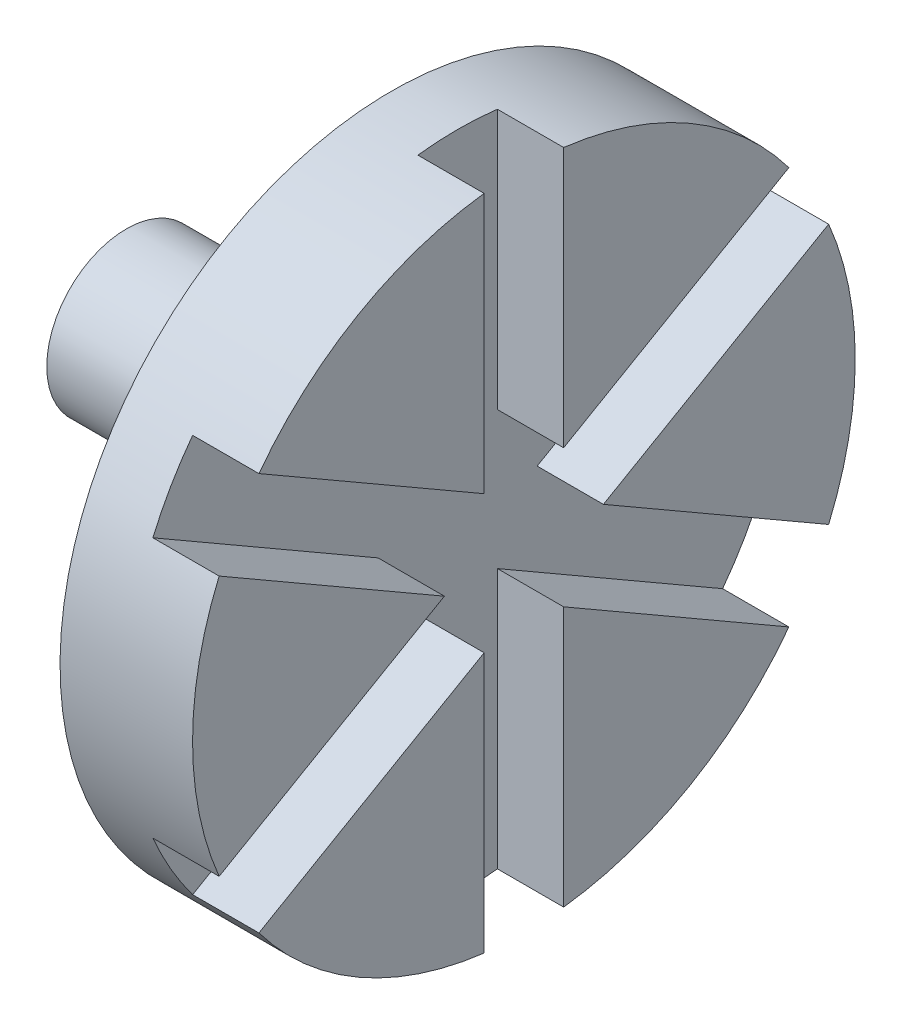
ISO-10303-21;
HEADER;
FILE_DESCRIPTION(('STEP AP214'),'2;1');
FILE_NAME('part.step','',(''),(''),'','','');
FILE_SCHEMA(('AUTOMOTIVE_DESIGN { 1 0 10303 214 1 1 1 1 }'));
ENDSEC;
DATA;
#1=APPLICATION_CONTEXT('core data for automotive mechanical design processes');
#2=APPLICATION_PROTOCOL_DEFINITION('international standard','automotive_design',2000,#1);
#3=PRODUCT_CONTEXT('',#1,'mechanical');
#4=PRODUCT('Part','Part','',(#3));
#5=PRODUCT_RELATED_PRODUCT_CATEGORY('part','',(#4));
#6=PRODUCT_DEFINITION_FORMATION('','',#4);
#7=PRODUCT_DEFINITION_CONTEXT('part definition',#1,'design');
#8=PRODUCT_DEFINITION('design','',#6,#7);
#9=PRODUCT_DEFINITION_SHAPE('','',#8);
#10=(LENGTH_UNIT() NAMED_UNIT(*) SI_UNIT(.MILLI.,.METRE.));
#11=(NAMED_UNIT(*) PLANE_ANGLE_UNIT() SI_UNIT($,.RADIAN.));
#12=(NAMED_UNIT(*) SI_UNIT($,.STERADIAN.) SOLID_ANGLE_UNIT());
#13=UNCERTAINTY_MEASURE_WITH_UNIT(LENGTH_MEASURE(1.E-05),#10,'distance_accuracy_value','');
#14=(GEOMETRIC_REPRESENTATION_CONTEXT(3) GLOBAL_UNCERTAINTY_ASSIGNED_CONTEXT((#13)) GLOBAL_UNIT_ASSIGNED_CONTEXT((#10,
#11,#12)) REPRESENTATION_CONTEXT('',''));
#15=CARTESIAN_POINT('',(0.,0.,0.));
#16=DIRECTION('',(0.,0.,1.));
#17=DIRECTION('',(1.,0.,0.));
#18=AXIS2_PLACEMENT_3D('',#15,#16,#17);
#19=CARTESIAN_POINT('',(10.,0.,0.));
#20=DIRECTION('',(1.,0.,0.));
#21=DIRECTION('',(0.,0.,-1.));
#22=AXIS2_PLACEMENT_3D('',#19,#20,#21);
#23=PLANE('',#22);
#24=DIRECTION('',(0.,1.,-1.48956837889716E-13));
#25=VECTOR('',#24,1.);
#26=CARTESIAN_POINT('',(10.,10.3923048454141,5.99999999999874));
#27=LINE('',#26,#25);
#28=CARTESIAN_POINT('',(10.,10.3923048454141,5.99999999999874));
#29=VERTEX_POINT('',#28);
#30=CARTESIAN_POINT('',(10.,49.6386945839643,5.99999999999289));
#31=VERTEX_POINT('',#30);
#32=EDGE_CURVE('E53',#29,#31,#27,.T.);
#33=ORIENTED_EDGE('',*,*,#32,.F.);
#34=DIRECTION('',(0.,-0.50000000000013,-0.866025403784363));
#35=VECTOR('',#34,1.);
#36=CARTESIAN_POINT('',(10.,10.3923048454141,5.99999999999874));
#37=LINE('',#36,#35);
#38=CARTESIAN_POINT('',(10.,30.0154997146943,39.9883705204051));
#39=VERTEX_POINT('',#38);
#40=EDGE_CURVE('E181',#39,#29,#37,.T.);
#41=ORIENTED_EDGE('',*,*,#40,.F.);
#42=CARTESIAN_POINT('',(10.,0.,0.));
#43=DIRECTION('',(1.,0.,0.));
#44=DIRECTION('',(0.,0.,-1.));
#45=AXIS2_PLACEMENT_3D('',#42,#43,#44);
#46=CIRCLE('',#45,50.);
#47=CARTESIAN_POINT('',(10.,19.6231948692802,45.9883705204072));
#48=VERTEX_POINT('',#47);
#49=EDGE_CURVE('E296',#39,#48,#46,.T.);
#50=ORIENTED_EDGE('',*,*,#49,.T.);
#51=DIRECTION('',(0.,0.500000000000103,0.866025403784379));
#52=VECTOR('',#51,1.);
#53=CARTESIAN_POINT('',(10.,1.17160607255054E-12,12.0000000000004));
#54=LINE('',#53,#52);
#55=CARTESIAN_POINT('',(10.,1.17354043149831E-12,12.0000000000004));
#56=VERTEX_POINT('',#55);
#57=EDGE_CURVE('E185',#56,#48,#54,.T.);
#58=ORIENTED_EDGE('',*,*,#57,.F.);
#59=DIRECTION('',(0.,0.499999999999896,-0.866025403784499));
#60=VECTOR('',#59,1.);
#61=CARTESIAN_POINT('',(10.,1.17160607255054E-12,12.0000000000004));
#62=LINE('',#61,#60);
#63=CARTESIAN_POINT('',(10.,-19.6231948692698,45.9883705204121));
#64=VERTEX_POINT('',#63);
#65=EDGE_CURVE('E182',#64,#56,#62,.T.);
#66=ORIENTED_EDGE('',*,*,#65,.F.);
#67=CARTESIAN_POINT('',(10.,-30.015499714685,39.9883705204119));
#68=VERTEX_POINT('',#67);
#69=EDGE_CURVE('E300',#64,#68,#46,.T.);
#70=ORIENTED_EDGE('',*,*,#69,.T.);
#71=DIRECTION('',(0.,-0.499999999999923,0.866025403784483));
#72=VECTOR('',#71,1.);
#73=CARTESIAN_POINT('',(10.,-10.3923048454132,6.00000000000117));
#74=LINE('',#73,#72);
#75=CARTESIAN_POINT('',(10.,-10.3923048454132,6.00000000000117));
#76=VERTEX_POINT('',#75);
#77=EDGE_CURVE('E214',#76,#68,#74,.T.);
#78=ORIENTED_EDGE('',*,*,#77,.F.);
#79=DIRECTION('',(0.,1.,0.));
#80=VECTOR('',#79,1.);
#81=CARTESIAN_POINT('',(10.,-10.3923048454132,6.00000000000117));
#82=LINE('',#81,#80);
#83=CARTESIAN_POINT('',(10.,-49.6386945839633,6.00000000000469));
#84=VERTEX_POINT('',#83);
#85=EDGE_CURVE('E209',#84,#76,#82,.T.);
#86=ORIENTED_EDGE('',*,*,#85,.F.);
#87=CARTESIAN_POINT('',(10.,-49.6386945839638,-5.99999999999705));
#88=VERTEX_POINT('',#87);
#89=EDGE_CURVE('E299',#84,#88,#46,.T.);
#90=ORIENTED_EDGE('',*,*,#89,.T.);
#91=DIRECTION('',(0.,-1.,0.));
#92=VECTOR('',#91,1.);
#93=CARTESIAN_POINT('',(10.,-10.3923048454133,-5.99999999999999));
#94=LINE('',#93,#92);
#95=CARTESIAN_POINT('',(10.,-10.3923048454133,-5.99999999999999));
#96=VERTEX_POINT('',#95);
#97=EDGE_CURVE('E258',#96,#88,#94,.T.);
#98=ORIENTED_EDGE('',*,*,#97,.F.);
#99=DIRECTION('',(0.,0.500000000000074,0.866025403784396));
#100=VECTOR('',#99,1.);
#101=CARTESIAN_POINT('',(10.,-10.3923048454133,-5.99999999999999));
#102=LINE('',#101,#100);
#103=CARTESIAN_POINT('',(10.,-30.0154997146912,-39.9883705204076));
#104=VERTEX_POINT('',#103);
#105=EDGE_CURVE('E253',#104,#96,#102,.T.);
#106=ORIENTED_EDGE('',*,*,#105,.F.);
#107=CARTESIAN_POINT('',(10.,-19.6231948692766,-45.9883705204089));
#108=VERTEX_POINT('',#107);
#109=EDGE_CURVE('E297',#104,#108,#46,.T.);
#110=ORIENTED_EDGE('',*,*,#109,.T.);
#111=DIRECTION('',(0.,-0.500000000000034,-0.866025403784419));
#112=VECTOR('',#111,1.);
#113=CARTESIAN_POINT('',(10.,0.,-12.));
#114=LINE('',#113,#112);
#115=CARTESIAN_POINT('',(10.,0.,-12.));
#116=VERTEX_POINT('',#115);
#117=EDGE_CURVE('E280',#116,#108,#114,.T.);
#118=ORIENTED_EDGE('',*,*,#117,.F.);
#119=DIRECTION('',(0.,-0.499999999999962,0.866025403784461));
#120=VECTOR('',#119,1.);
#121=CARTESIAN_POINT('',(10.,0.,-12.));
#122=LINE('',#121,#120);
#123=CARTESIAN_POINT('',(10.,19.6231948692735,-45.98837052041));
#124=VERTEX_POINT('',#123);
#125=EDGE_CURVE('E275',#124,#116,#122,.T.);
#126=ORIENTED_EDGE('',*,*,#125,.F.);
#127=CARTESIAN_POINT('',(10.,30.0154997146884,-39.9883705204093));
#128=VERTEX_POINT('',#127);
#129=EDGE_CURVE('E45',#124,#128,#46,.T.);
#130=ORIENTED_EDGE('',*,*,#129,.T.);
#131=DIRECTION('',(0.,0.500000000000001,-0.866025403784438));
#132=VECTOR('',#131,1.);
#133=CARTESIAN_POINT('',(10.,10.3923048454133,-5.99999999999996));
#134=LINE('',#133,#132);
#135=CARTESIAN_POINT('',(10.,10.3923048454133,-5.99999999999997));
#136=VERTEX_POINT('',#135);
#137=EDGE_CURVE('E236',#136,#128,#134,.T.);
#138=ORIENTED_EDGE('',*,*,#137,.F.);
#139=DIRECTION('',(0.,-1.,0.));
#140=VECTOR('',#139,1.);
#141=CARTESIAN_POINT('',(10.,10.3923048454133,-5.99999999999996));
#142=LINE('',#141,#140);
#143=CARTESIAN_POINT('',(10.,49.6386945839634,-5.99999999999997));
#144=VERTEX_POINT('',#143);
#145=EDGE_CURVE('E231',#144,#136,#142,.T.);
#146=ORIENTED_EDGE('',*,*,#145,.F.);
#147=EDGE_CURVE('E58',#144,#31,#46,.T.);
#148=ORIENTED_EDGE('',*,*,#147,.T.);
#149=EDGE_LOOP('',(#33,#41,#50,#58,#66,#70,#78,#86,#90,#98,#106,#110,#118,#126,#130,#138,#146,#148));
#150=FACE_BOUND('',#149,.T.);
#151=ADVANCED_FACE('F36',(#150),#23,.T.);
#152=CARTESIAN_POINT('',(10.,0.,0.));
#153=DIRECTION('',(-1.,0.,0.));
#154=DIRECTION('',(0.,0.,1.));
#155=AXIS2_PLACEMENT_3D('',#152,#153,#154);
#156=CYLINDRICAL_SURFACE('',#155,50.);
#157=ORIENTED_EDGE('',*,*,#129,.F.);
#158=DIRECTION('',(-1.,0.,0.));
#159=VECTOR('',#158,1.);
#160=CARTESIAN_POINT('',(20.,19.6231948692735,-45.9883705204101));
#161=LINE('',#160,#159);
#162=CARTESIAN_POINT('',(20.,19.6231948692735,-45.9883705204101));
#163=VERTEX_POINT('',#162);
#164=EDGE_CURVE('E284',#163,#124,#161,.T.);
#165=ORIENTED_EDGE('',*,*,#164,.F.);
#166=CARTESIAN_POINT('',(20.,-2.15105711021124E-13,1.31838984174237E-13));
#167=DIRECTION('',(1.,0.,0.));
#168=DIRECTION('',(0.,0.,1.));
#169=AXIS2_PLACEMENT_3D('',#166,#167,#168);
#170=CIRCLE('',#169,50.0000000000002);
#171=CARTESIAN_POINT('',(20.,-19.6231948692766,-45.9883705204089));
#172=VERTEX_POINT('',#171);
#173=EDGE_CURVE('E282',#172,#163,#170,.T.);
#174=ORIENTED_EDGE('',*,*,#173,.F.);
#175=DIRECTION('',(-1.,0.,0.));
#176=VECTOR('',#175,1.);
#177=CARTESIAN_POINT('',(20.,-19.6231948692766,-45.9883705204089));
#178=LINE('',#177,#176);
#179=EDGE_CURVE('E291',#172,#108,#178,.T.);
#180=ORIENTED_EDGE('',*,*,#179,.T.);
#181=ORIENTED_EDGE('',*,*,#109,.F.);
#182=DIRECTION('',(-1.,0.,0.));
#183=VECTOR('',#182,1.);
#184=CARTESIAN_POINT('',(20.,-30.0154997146912,-39.9883705204076));
#185=LINE('',#184,#183);
#186=CARTESIAN_POINT('',(20.,-30.0154997146912,-39.9883705204076));
#187=VERTEX_POINT('',#186);
#188=EDGE_CURVE('E262',#187,#104,#185,.T.);
#189=ORIENTED_EDGE('',*,*,#188,.F.);
#190=CARTESIAN_POINT('',(20.,-2.15105711021124E-13,1.31838984174237E-13));
#191=DIRECTION('',(1.,0.,0.));
#192=DIRECTION('',(0.,0.,1.));
#193=AXIS2_PLACEMENT_3D('',#190,#191,#192);
#194=CIRCLE('',#193,50.0000000000003);
#195=CARTESIAN_POINT('',(20.,-49.6386945839642,-5.99999999999711));
#196=VERTEX_POINT('',#195);
#197=EDGE_CURVE('E260',#196,#187,#194,.T.);
#198=ORIENTED_EDGE('',*,*,#197,.F.);
#199=DIRECTION('',(-1.,0.,0.));
#200=VECTOR('',#199,1.);
#201=CARTESIAN_POINT('',(20.,-49.6386945839642,-5.99999999999711));
#202=LINE('',#201,#200);
#203=EDGE_CURVE('E269',#196,#88,#202,.T.);
#204=ORIENTED_EDGE('',*,*,#203,.T.);
#205=ORIENTED_EDGE('',*,*,#89,.F.);
#206=DIRECTION('',(-1.,0.,0.));
#207=VECTOR('',#206,1.);
#208=CARTESIAN_POINT('',(20.,-49.6386945839633,6.00000000000469));
#209=LINE('',#208,#207);
#210=CARTESIAN_POINT('',(20.,-49.6386945839633,6.00000000000469));
#211=VERTEX_POINT('',#210);
#212=EDGE_CURVE('E218',#211,#84,#209,.T.);
#213=ORIENTED_EDGE('',*,*,#212,.F.);
#214=CARTESIAN_POINT('',(20.,-2.15105711021124E-13,1.31838984174237E-13));
#215=DIRECTION('',(1.,0.,0.));
#216=DIRECTION('',(0.,0.,1.));
#217=AXIS2_PLACEMENT_3D('',#214,#215,#216);
#218=CIRCLE('',#217,50.0000000000003);
#219=CARTESIAN_POINT('',(20.,-30.0154997146853,39.9883705204123));
#220=VERTEX_POINT('',#219);
#221=EDGE_CURVE('E216',#220,#211,#218,.T.);
#222=ORIENTED_EDGE('',*,*,#221,.F.);
#223=DIRECTION('',(-1.,0.,0.));
#224=VECTOR('',#223,1.);
#225=CARTESIAN_POINT('',(20.,-30.0154997146853,39.9883705204123));
#226=LINE('',#225,#224);
#227=EDGE_CURVE('E225',#220,#68,#226,.T.);
#228=ORIENTED_EDGE('',*,*,#227,.T.);
#229=ORIENTED_EDGE('',*,*,#69,.F.);
#230=DIRECTION('',(-1.,0.,0.));
#231=VECTOR('',#230,1.);
#232=CARTESIAN_POINT('',(20.,-19.6231948692698,45.9883705204121));
#233=LINE('',#232,#231);
#234=CARTESIAN_POINT('',(20.,-19.6231948692698,45.9883705204121));
#235=VERTEX_POINT('',#234);
#236=EDGE_CURVE('E197',#235,#64,#233,.T.);
#237=ORIENTED_EDGE('',*,*,#236,.F.);
#238=CARTESIAN_POINT('',(20.,-2.15105711021124E-13,1.31838984174237E-13));
#239=DIRECTION('',(1.,0.,0.));
#240=DIRECTION('',(0.,0.,1.));
#241=AXIS2_PLACEMENT_3D('',#238,#239,#240);
#242=CIRCLE('',#241,50.0000000000002);
#243=CARTESIAN_POINT('',(20.,19.6231948692803,45.9883705204074));
#244=VERTEX_POINT('',#243);
#245=EDGE_CURVE('E196',#244,#235,#242,.T.);
#246=ORIENTED_EDGE('',*,*,#245,.F.);
#247=DIRECTION('',(-1.,0.,0.));
#248=VECTOR('',#247,1.);
#249=CARTESIAN_POINT('',(20.,19.6231948692803,45.9883705204074));
#250=LINE('',#249,#248);
#251=EDGE_CURVE('E203',#244,#48,#250,.T.);
#252=ORIENTED_EDGE('',*,*,#251,.T.);
#253=ORIENTED_EDGE('',*,*,#49,.F.);
#254=DIRECTION('',(-1.,0.,0.));
#255=VECTOR('',#254,1.);
#256=CARTESIAN_POINT('',(20.,30.0154997146943,39.9883705204051));
#257=LINE('',#256,#255);
#258=CARTESIAN_POINT('',(20.,30.0154997146943,39.9883705204051));
#259=VERTEX_POINT('',#258);
#260=EDGE_CURVE('E187',#259,#39,#257,.T.);
#261=ORIENTED_EDGE('',*,*,#260,.F.);
#262=CARTESIAN_POINT('',(20.,-2.15105711021124E-13,1.31838984174237E-13));
#263=DIRECTION('',(1.,0.,0.));
#264=DIRECTION('',(0.,0.,1.));
#265=AXIS2_PLACEMENT_3D('',#262,#263,#264);
#266=CIRCLE('',#265,50.0000000000002);
#267=CARTESIAN_POINT('',(20.,49.6386945839643,5.99999999999289));
#268=VERTEX_POINT('',#267);
#269=EDGE_CURVE('E171',#268,#259,#266,.T.);
#270=ORIENTED_EDGE('',*,*,#269,.F.);
#271=DIRECTION('',(-1.,0.,0.));
#272=VECTOR('',#271,1.);
#273=CARTESIAN_POINT('',(20.,49.6386945839643,5.99999999999289));
#274=LINE('',#273,#272);
#275=EDGE_CURVE('E168',#268,#31,#274,.T.);
#276=ORIENTED_EDGE('',*,*,#275,.T.);
#277=ORIENTED_EDGE('',*,*,#147,.F.);
#278=DIRECTION('',(-1.,0.,0.));
#279=VECTOR('',#278,1.);
#280=CARTESIAN_POINT('',(20.,49.6386945839634,-5.99999999999997));
#281=LINE('',#280,#279);
#282=CARTESIAN_POINT('',(20.,49.6386945839634,-5.99999999999997));
#283=VERTEX_POINT('',#282);
#284=EDGE_CURVE('E240',#283,#144,#281,.T.);
#285=ORIENTED_EDGE('',*,*,#284,.F.);
#286=CARTESIAN_POINT('',(20.,-2.15105711021124E-13,1.31838984174237E-13));
#287=DIRECTION('',(1.,0.,0.));
#288=DIRECTION('',(0.,0.,1.));
#289=AXIS2_PLACEMENT_3D('',#286,#287,#288);
#290=CIRCLE('',#289,50.0000000000002);
#291=CARTESIAN_POINT('',(20.,30.0154997146884,-39.9883705204093));
#292=VERTEX_POINT('',#291);
#293=EDGE_CURVE('E238',#292,#283,#290,.T.);
#294=ORIENTED_EDGE('',*,*,#293,.F.);
#295=DIRECTION('',(-1.,0.,0.));
#296=VECTOR('',#295,1.);
#297=CARTESIAN_POINT('',(20.,30.0154997146884,-39.9883705204093));
#298=LINE('',#297,#296);
#299=EDGE_CURVE('E247',#292,#128,#298,.T.);
#300=ORIENTED_EDGE('',*,*,#299,.T.);
#301=EDGE_LOOP('',(#157,#165,#174,#180,#181,#189,#198,#204,#205,#213,#222,#228,#229,#237,#246,
#252,#253,#261,#270,#276,#277,#285,#294,#300));
#302=FACE_BOUND('',#301,.T.);
#303=CARTESIAN_POINT('',(0.,0.,0.));
#304=DIRECTION('',(1.,0.,0.));
#305=DIRECTION('',(0.,0.,-1.));
#306=AXIS2_PLACEMENT_3D('',#303,#304,#305);
#307=CIRCLE('',#306,50.);
#308=CARTESIAN_POINT('',(0.,0.,-50.));
#309=VERTEX_POINT('',#308);
#310=EDGE_CURVE('E40',#309,#309,#307,.T.);
#311=ORIENTED_EDGE('',*,*,#310,.T.);
#312=EDGE_LOOP('',(#311));
#313=FACE_BOUND('',#312,.T.);
#314=ADVANCED_FACE('F38',(#302,#313),#156,.T.);
#315=CARTESIAN_POINT('',(0.,0.,0.));
#316=DIRECTION('',(1.,0.,0.));
#317=DIRECTION('',(0.,0.,-1.));
#318=AXIS2_PLACEMENT_3D('',#315,#316,#317);
#319=PLANE('',#318);
#320=CARTESIAN_POINT('',(0.,0.,0.));
#321=DIRECTION('',(-1.,0.,0.));
#322=DIRECTION('',(0.,0.,1.));
#323=AXIS2_PLACEMENT_3D('',#320,#321,#322);
#324=CIRCLE('',#323,12.);
#325=CARTESIAN_POINT('',(0.,0.,12.));
#326=VERTEX_POINT('',#325);
#327=EDGE_CURVE('E11',#326,#326,#324,.T.);
#328=ORIENTED_EDGE('',*,*,#327,.F.);
#329=EDGE_LOOP('',(#328));
#330=FACE_BOUND('',#329,.T.);
#331=ORIENTED_EDGE('',*,*,#310,.F.);
#332=EDGE_LOOP('',(#331));
#333=FACE_BOUND('',#332,.T.);
#334=ADVANCED_FACE('F306',(#330,#333),#319,.F.);
#335=CARTESIAN_POINT('',(20.,0.,-12.));
#336=DIRECTION('',(0.,-0.866025403784461,-0.499999999999962));
#337=DIRECTION('',(0.,0.499999999999962,-0.866025403784461));
#338=AXIS2_PLACEMENT_3D('',#335,#336,#337);
#339=PLANE('',#338);
#340=ORIENTED_EDGE('',*,*,#125,.T.);
#341=DIRECTION('',(-1.,0.,0.));
#342=VECTOR('',#341,1.);
#343=CARTESIAN_POINT('',(20.,0.,-12.));
#344=LINE('',#343,#342);
#345=CARTESIAN_POINT('',(20.,0.,-12.));
#346=VERTEX_POINT('',#345);
#347=EDGE_CURVE('E294',#346,#116,#344,.T.);
#348=ORIENTED_EDGE('',*,*,#347,.F.);
#349=DIRECTION('',(0.,-0.499999999999962,0.866025403784461));
#350=VECTOR('',#349,1.);
#351=CARTESIAN_POINT('',(20.,0.,-12.));
#352=LINE('',#351,#350);
#353=EDGE_CURVE('E276',#163,#346,#352,.T.);
#354=ORIENTED_EDGE('',*,*,#353,.F.);
#355=ORIENTED_EDGE('',*,*,#164,.T.);
#356=EDGE_LOOP('',(#340,#348,#354,#355));
#357=FACE_BOUND('',#356,.T.);
#358=ADVANCED_FACE('F308',(#357),#339,.F.);
#359=CARTESIAN_POINT('',(20.,0.,-12.));
#360=DIRECTION('',(0.,0.866025403784419,-0.500000000000034));
#361=DIRECTION('',(0.,0.500000000000034,0.866025403784419));
#362=AXIS2_PLACEMENT_3D('',#359,#360,#361);
#363=PLANE('',#362);
#364=ORIENTED_EDGE('',*,*,#117,.T.);
#365=ORIENTED_EDGE('',*,*,#179,.F.);
#366=DIRECTION('',(0.,-0.500000000000034,-0.866025403784419));
#367=VECTOR('',#366,1.);
#368=CARTESIAN_POINT('',(20.,0.,-12.));
#369=LINE('',#368,#367);
#370=EDGE_CURVE('E279',#346,#172,#369,.T.);
#371=ORIENTED_EDGE('',*,*,#370,.F.);
#372=ORIENTED_EDGE('',*,*,#347,.T.);
#373=EDGE_LOOP('',(#364,#365,#371,#372));
#374=FACE_BOUND('',#373,.T.);
#375=ADVANCED_FACE('F314',(#374),#363,.F.);
#376=CARTESIAN_POINT('',(20.,-2.15105711021124E-13,1.31838984174237E-13));
#377=DIRECTION('',(-1.,0.,0.));
#378=DIRECTION('',(0.,0.,1.));
#379=AXIS2_PLACEMENT_3D('',#376,#377,#378);
#380=PLANE('',#379);
#381=ORIENTED_EDGE('',*,*,#353,.T.);
#382=ORIENTED_EDGE('',*,*,#370,.T.);
#383=ORIENTED_EDGE('',*,*,#173,.T.);
#384=EDGE_LOOP('',(#381,#382,#383));
#385=FACE_BOUND('',#384,.T.);
#386=ADVANCED_FACE('F326',(#385),#380,.F.);
#387=CARTESIAN_POINT('',(20.,-10.3923048454133,-5.99999999999999));
#388=DIRECTION('',(0.,-0.866025403784396,0.500000000000074));
#389=DIRECTION('',(0.,-0.500000000000074,-0.866025403784396));
#390=AXIS2_PLACEMENT_3D('',#387,#388,#389);
#391=PLANE('',#390);
#392=ORIENTED_EDGE('',*,*,#105,.T.);
#393=DIRECTION('',(-1.,0.,0.));
#394=VECTOR('',#393,1.);
#395=CARTESIAN_POINT('',(20.,-10.3923048454133,-5.99999999999999));
#396=LINE('',#395,#394);
#397=CARTESIAN_POINT('',(20.,-10.3923048454133,-5.99999999999999));
#398=VERTEX_POINT('',#397);
#399=EDGE_CURVE('E272',#398,#96,#396,.T.);
#400=ORIENTED_EDGE('',*,*,#399,.F.);
#401=DIRECTION('',(0.,0.500000000000074,0.866025403784396));
#402=VECTOR('',#401,1.);
#403=CARTESIAN_POINT('',(20.,-10.3923048454133,-5.99999999999999));
#404=LINE('',#403,#402);
#405=EDGE_CURVE('E254',#187,#398,#404,.T.);
#406=ORIENTED_EDGE('',*,*,#405,.F.);
#407=ORIENTED_EDGE('',*,*,#188,.T.);
#408=EDGE_LOOP('',(#392,#400,#406,#407));
#409=FACE_BOUND('',#408,.T.);
#410=ADVANCED_FACE('F330',(#409),#391,.F.);
#411=CARTESIAN_POINT('',(20.,-10.3923048454133,-5.99999999999999));
#412=DIRECTION('',(0.,0.,-1.));
#413=DIRECTION('',(0.,1.,0.));
#414=AXIS2_PLACEMENT_3D('',#411,#412,#413);
#415=PLANE('',#414);
#416=ORIENTED_EDGE('',*,*,#97,.T.);
#417=ORIENTED_EDGE('',*,*,#203,.F.);
#418=DIRECTION('',(0.,-1.,0.));
#419=VECTOR('',#418,1.);
#420=CARTESIAN_POINT('',(20.,-10.3923048454133,-5.99999999999999));
#421=LINE('',#420,#419);
#422=EDGE_CURVE('E257',#398,#196,#421,.T.);
#423=ORIENTED_EDGE('',*,*,#422,.F.);
#424=ORIENTED_EDGE('',*,*,#399,.T.);
#425=EDGE_LOOP('',(#416,#417,#423,#424));
#426=FACE_BOUND('',#425,.T.);
#427=ADVANCED_FACE('F334',(#426),#415,.F.);
#428=CARTESIAN_POINT('',(20.,-2.15105711021124E-13,1.31838984174237E-13));
#429=DIRECTION('',(-1.,0.,0.));
#430=DIRECTION('',(0.,0.,1.));
#431=AXIS2_PLACEMENT_3D('',#428,#429,#430);
#432=PLANE('',#431);
#433=ORIENTED_EDGE('',*,*,#405,.T.);
#434=ORIENTED_EDGE('',*,*,#422,.T.);
#435=ORIENTED_EDGE('',*,*,#197,.T.);
#436=EDGE_LOOP('',(#433,#434,#435));
#437=FACE_BOUND('',#436,.T.);
#438=ADVANCED_FACE('F338',(#437),#432,.F.);
#439=CARTESIAN_POINT('',(20.,10.3923048454133,-5.99999999999996));
#440=DIRECTION('',(0.,0.,-1.));
#441=DIRECTION('',(-1.,0.,0.));
#442=AXIS2_PLACEMENT_3D('',#439,#440,#441);
#443=PLANE('',#442);
#444=ORIENTED_EDGE('',*,*,#145,.T.);
#445=DIRECTION('',(-1.,0.,0.));
#446=VECTOR('',#445,1.);
#447=CARTESIAN_POINT('',(20.,10.3923048454133,-5.99999999999996));
#448=LINE('',#447,#446);
#449=CARTESIAN_POINT('',(20.,10.3923048454133,-5.99999999999996));
#450=VERTEX_POINT('',#449);
#451=EDGE_CURVE('E250',#450,#136,#448,.T.);
#452=ORIENTED_EDGE('',*,*,#451,.F.);
#453=DIRECTION('',(0.,-1.,0.));
#454=VECTOR('',#453,1.);
#455=CARTESIAN_POINT('',(20.,10.3923048454133,-5.99999999999996));
#456=LINE('',#455,#454);
#457=EDGE_CURVE('E232',#283,#450,#456,.T.);
#458=ORIENTED_EDGE('',*,*,#457,.F.);
#459=ORIENTED_EDGE('',*,*,#284,.T.);
#460=EDGE_LOOP('',(#444,#452,#458,#459));
#461=FACE_BOUND('',#460,.T.);
#462=ADVANCED_FACE('F342',(#461),#443,.F.);
#463=CARTESIAN_POINT('',(20.,10.3923048454133,-5.99999999999996));
#464=DIRECTION('',(0.,0.866025403784438,0.500000000000001));
#465=DIRECTION('',(0.,-0.500000000000001,0.866025403784438));
#466=AXIS2_PLACEMENT_3D('',#463,#464,#465);
#467=PLANE('',#466);
#468=ORIENTED_EDGE('',*,*,#137,.T.);
#469=ORIENTED_EDGE('',*,*,#299,.F.);
#470=DIRECTION('',(0.,0.500000000000001,-0.866025403784438));
#471=VECTOR('',#470,1.);
#472=CARTESIAN_POINT('',(20.,10.3923048454133,-5.99999999999996));
#473=LINE('',#472,#471);
#474=EDGE_CURVE('E235',#450,#292,#473,.T.);
#475=ORIENTED_EDGE('',*,*,#474,.F.);
#476=ORIENTED_EDGE('',*,*,#451,.T.);
#477=EDGE_LOOP('',(#468,#469,#475,#476));
#478=FACE_BOUND('',#477,.T.);
#479=ADVANCED_FACE('F346',(#478),#467,.F.);
#480=CARTESIAN_POINT('',(20.,-2.15105711021124E-13,1.31838984174237E-13));
#481=DIRECTION('',(-1.,0.,0.));
#482=DIRECTION('',(0.,0.,1.));
#483=AXIS2_PLACEMENT_3D('',#480,#481,#482);
#484=PLANE('',#483);
#485=ORIENTED_EDGE('',*,*,#457,.T.);
#486=ORIENTED_EDGE('',*,*,#474,.T.);
#487=ORIENTED_EDGE('',*,*,#293,.T.);
#488=EDGE_LOOP('',(#485,#486,#487));
#489=FACE_BOUND('',#488,.T.);
#490=ADVANCED_FACE('F350',(#489),#484,.F.);
#491=CARTESIAN_POINT('',(20.,-10.3923048454132,6.00000000000117));
#492=DIRECTION('',(0.,0.,1.));
#493=DIRECTION('',(0.,-1.,0.));
#494=AXIS2_PLACEMENT_3D('',#491,#492,#493);
#495=PLANE('',#494);
#496=ORIENTED_EDGE('',*,*,#85,.T.);
#497=DIRECTION('',(-1.,0.,0.));
#498=VECTOR('',#497,1.);
#499=CARTESIAN_POINT('',(20.,-10.3923048454132,6.00000000000117));
#500=LINE('',#499,#498);
#501=CARTESIAN_POINT('',(20.,-10.3923048454132,6.00000000000117));
#502=VERTEX_POINT('',#501);
#503=EDGE_CURVE('E228',#502,#76,#500,.T.);
#504=ORIENTED_EDGE('',*,*,#503,.F.);
#505=DIRECTION('',(0.,1.,0.));
#506=VECTOR('',#505,1.);
#507=CARTESIAN_POINT('',(20.,-10.3923048454132,6.00000000000117));
#508=LINE('',#507,#506);
#509=EDGE_CURVE('E210',#211,#502,#508,.T.);
#510=ORIENTED_EDGE('',*,*,#509,.F.);
#511=ORIENTED_EDGE('',*,*,#212,.T.);
#512=EDGE_LOOP('',(#496,#504,#510,#511));
#513=FACE_BOUND('',#512,.T.);
#514=ADVANCED_FACE('F354',(#513),#495,.F.);
#515=CARTESIAN_POINT('',(20.,-10.3923048454132,6.00000000000117));
#516=DIRECTION('',(0.,-0.866025403784483,-0.499999999999923));
#517=DIRECTION('',(0.,0.499999999999923,-0.866025403784483));
#518=AXIS2_PLACEMENT_3D('',#515,#516,#517);
#519=PLANE('',#518);
#520=ORIENTED_EDGE('',*,*,#77,.T.);
#521=ORIENTED_EDGE('',*,*,#227,.F.);
#522=DIRECTION('',(0.,-0.499999999999923,0.866025403784483));
#523=VECTOR('',#522,1.);
#524=CARTESIAN_POINT('',(20.,-10.3923048454132,6.00000000000117));
#525=LINE('',#524,#523);
#526=EDGE_CURVE('E213',#502,#220,#525,.T.);
#527=ORIENTED_EDGE('',*,*,#526,.F.);
#528=ORIENTED_EDGE('',*,*,#503,.T.);
#529=EDGE_LOOP('',(#520,#521,#527,#528));
#530=FACE_BOUND('',#529,.T.);
#531=ADVANCED_FACE('F358',(#530),#519,.F.);
#532=CARTESIAN_POINT('',(20.,-2.15105711021124E-13,1.31838984174237E-13));
#533=DIRECTION('',(-1.,0.,0.));
#534=DIRECTION('',(0.,0.,1.));
#535=AXIS2_PLACEMENT_3D('',#532,#533,#534);
#536=PLANE('',#535);
#537=ORIENTED_EDGE('',*,*,#509,.T.);
#538=ORIENTED_EDGE('',*,*,#526,.T.);
#539=ORIENTED_EDGE('',*,*,#221,.T.);
#540=EDGE_LOOP('',(#537,#538,#539));
#541=FACE_BOUND('',#540,.T.);
#542=ADVANCED_FACE('F362',(#541),#536,.F.);
#543=CARTESIAN_POINT('',(20.,1.17160607255054E-12,12.0000000000004));
#544=DIRECTION('',(0.,0.866025403784499,0.499999999999896));
#545=DIRECTION('',(0.,-0.499999999999896,0.866025403784499));
#546=AXIS2_PLACEMENT_3D('',#543,#544,#545);
#547=PLANE('',#546);
#548=ORIENTED_EDGE('',*,*,#65,.T.);
#549=DIRECTION('',(-1.,0.,0.));
#550=VECTOR('',#549,1.);
#551=CARTESIAN_POINT('',(20.,1.17160607255054E-12,12.0000000000004));
#552=LINE('',#551,#550);
#553=CARTESIAN_POINT('',(20.,1.17160607255054E-12,12.0000000000004));
#554=VERTEX_POINT('',#553);
#555=EDGE_CURVE('E206',#554,#56,#552,.T.);
#556=ORIENTED_EDGE('',*,*,#555,.F.);
#557=DIRECTION('',(0.,0.499999999999896,-0.866025403784499));
#558=VECTOR('',#557,1.);
#559=CARTESIAN_POINT('',(20.,1.17160607255054E-12,12.0000000000004));
#560=LINE('',#559,#558);
#561=EDGE_CURVE('E191',#235,#554,#560,.T.);
#562=ORIENTED_EDGE('',*,*,#561,.F.);
#563=ORIENTED_EDGE('',*,*,#236,.T.);
#564=EDGE_LOOP('',(#548,#556,#562,#563));
#565=FACE_BOUND('',#564,.T.);
#566=ADVANCED_FACE('F366',(#565),#547,.F.);
#567=CARTESIAN_POINT('',(20.,1.17160607255054E-12,12.0000000000004));
#568=DIRECTION('',(0.,-0.866025403784379,0.500000000000103));
#569=DIRECTION('',(0.,-0.500000000000103,-0.866025403784379));
#570=AXIS2_PLACEMENT_3D('',#567,#568,#569);
#571=PLANE('',#570);
#572=ORIENTED_EDGE('',*,*,#57,.T.);
#573=ORIENTED_EDGE('',*,*,#251,.F.);
#574=DIRECTION('',(0.,0.500000000000103,0.866025403784379));
#575=VECTOR('',#574,1.);
#576=CARTESIAN_POINT('',(20.,1.17160607255054E-12,12.0000000000004));
#577=LINE('',#576,#575);
#578=EDGE_CURVE('E194',#554,#244,#577,.T.);
#579=ORIENTED_EDGE('',*,*,#578,.F.);
#580=ORIENTED_EDGE('',*,*,#555,.T.);
#581=EDGE_LOOP('',(#572,#573,#579,#580));
#582=FACE_BOUND('',#581,.T.);
#583=ADVANCED_FACE('F370',(#582),#571,.F.);
#584=CARTESIAN_POINT('',(20.,-2.15105711021124E-13,1.31838984174237E-13));
#585=DIRECTION('',(-1.,0.,0.));
#586=DIRECTION('',(0.,0.,1.));
#587=AXIS2_PLACEMENT_3D('',#584,#585,#586);
#588=PLANE('',#587);
#589=ORIENTED_EDGE('',*,*,#561,.T.);
#590=ORIENTED_EDGE('',*,*,#578,.T.);
#591=ORIENTED_EDGE('',*,*,#245,.T.);
#592=EDGE_LOOP('',(#589,#590,#591));
#593=FACE_BOUND('',#592,.T.);
#594=ADVANCED_FACE('F374',(#593),#588,.F.);
#595=CARTESIAN_POINT('',(20.,10.3923048454141,5.99999999999874));
#596=DIRECTION('',(0.,0.866025403784363,-0.50000000000013));
#597=DIRECTION('',(0.,0.50000000000013,0.866025403784364));
#598=AXIS2_PLACEMENT_3D('',#595,#596,#597);
#599=PLANE('',#598);
#600=ORIENTED_EDGE('',*,*,#40,.T.);
#601=DIRECTION('',(-1.,0.,0.));
#602=VECTOR('',#601,1.);
#603=CARTESIAN_POINT('',(20.,10.3923048454141,5.99999999999874));
#604=LINE('',#603,#602);
#605=CARTESIAN_POINT('',(20.,10.3923048454141,5.99999999999874));
#606=VERTEX_POINT('',#605);
#607=EDGE_CURVE('E165',#606,#29,#604,.T.);
#608=ORIENTED_EDGE('',*,*,#607,.F.);
#609=DIRECTION('',(0.,-0.50000000000013,-0.866025403784363));
#610=VECTOR('',#609,1.);
#611=CARTESIAN_POINT('',(20.,10.3923048454141,5.99999999999874));
#612=LINE('',#611,#610);
#613=EDGE_CURVE('E172',#259,#606,#612,.T.);
#614=ORIENTED_EDGE('',*,*,#613,.F.);
#615=ORIENTED_EDGE('',*,*,#260,.T.);
#616=EDGE_LOOP('',(#600,#608,#614,#615));
#617=FACE_BOUND('',#616,.T.);
#618=ADVANCED_FACE('F180',(#617),#599,.F.);
#619=CARTESIAN_POINT('',(20.,10.3923048454141,5.99999999999874));
#620=DIRECTION('',(0.,1.48956837889716E-13,1.));
#621=DIRECTION('',(0.,-1.,1.48956837889716E-13));
#622=AXIS2_PLACEMENT_3D('',#619,#620,#621);
#623=PLANE('',#622);
#624=ORIENTED_EDGE('',*,*,#32,.T.);
#625=ORIENTED_EDGE('',*,*,#275,.F.);
#626=DIRECTION('',(0.,1.,-1.48956837889716E-13));
#627=VECTOR('',#626,1.);
#628=CARTESIAN_POINT('',(20.,10.3923048454141,5.99999999999874));
#629=LINE('',#628,#627);
#630=EDGE_CURVE('E161',#606,#268,#629,.T.);
#631=ORIENTED_EDGE('',*,*,#630,.F.);
#632=ORIENTED_EDGE('',*,*,#607,.T.);
#633=EDGE_LOOP('',(#624,#625,#631,#632));
#634=FACE_BOUND('',#633,.T.);
#635=ADVANCED_FACE('F163',(#634),#623,.F.);
#636=CARTESIAN_POINT('',(20.,-2.15105711021124E-13,1.31838984174237E-13));
#637=DIRECTION('',(-1.,0.,0.));
#638=DIRECTION('',(0.,0.,1.));
#639=AXIS2_PLACEMENT_3D('',#636,#637,#638);
#640=PLANE('',#639);
#641=ORIENTED_EDGE('',*,*,#613,.T.);
#642=ORIENTED_EDGE('',*,*,#630,.T.);
#643=ORIENTED_EDGE('',*,*,#269,.T.);
#644=EDGE_LOOP('',(#641,#642,#643));
#645=FACE_BOUND('',#644,.T.);
#646=ADVANCED_FACE('F175',(#645),#640,.F.);
#647=CARTESIAN_POINT('',(-40.,0.,0.));
#648=DIRECTION('',(1.,0.,0.));
#649=DIRECTION('',(0.,0.,-1.));
#650=AXIS2_PLACEMENT_3D('',#647,#648,#649);
#651=CYLINDRICAL_SURFACE('',#650,12.);
#652=CARTESIAN_POINT('',(-40.,0.,0.));
#653=DIRECTION('',(-1.,0.,0.));
#654=DIRECTION('',(0.,0.,1.));
#655=AXIS2_PLACEMENT_3D('',#652,#653,#654);
#656=CIRCLE('',#655,12.);
#657=CARTESIAN_POINT('',(-40.,0.,12.));
#658=VERTEX_POINT('',#657);
#659=EDGE_CURVE('E396',#658,#658,#656,.T.);
#660=ORIENTED_EDGE('',*,*,#659,.F.);
#661=EDGE_LOOP('',(#660));
#662=FACE_BOUND('',#661,.T.);
#663=ORIENTED_EDGE('',*,*,#327,.T.);
#664=EDGE_LOOP('',(#663));
#665=FACE_BOUND('',#664,.T.);
#666=ADVANCED_FACE('F385',(#662,#665),#651,.T.);
#667=CARTESIAN_POINT('',(-40.,0.,0.));
#668=DIRECTION('',(-1.,0.,0.));
#669=DIRECTION('',(0.,0.,1.));
#670=AXIS2_PLACEMENT_3D('',#667,#668,#669);
#671=PLANE('',#670);
#672=ORIENTED_EDGE('',*,*,#659,.T.);
#673=EDGE_LOOP('',(#672));
#674=FACE_BOUND('',#673,.T.);
#675=ADVANCED_FACE('F388',(#674),#671,.T.);
#676=CLOSED_SHELL('',(#151,#314,#334,#358,#375,#386,#410,#427,#438,#462,#479,#490,#514,#531,
#542,#566,#583,#594,#618,#635,#646,#666,#675));
#677=MANIFOLD_SOLID_BREP('B2',#676);
#678=ADVANCED_BREP_SHAPE_REPRESENTATION('',(#18,#677),#14);
#679=SHAPE_DEFINITION_REPRESENTATION(#9,#678);
ENDSEC;
END-ISO-10303-21;
